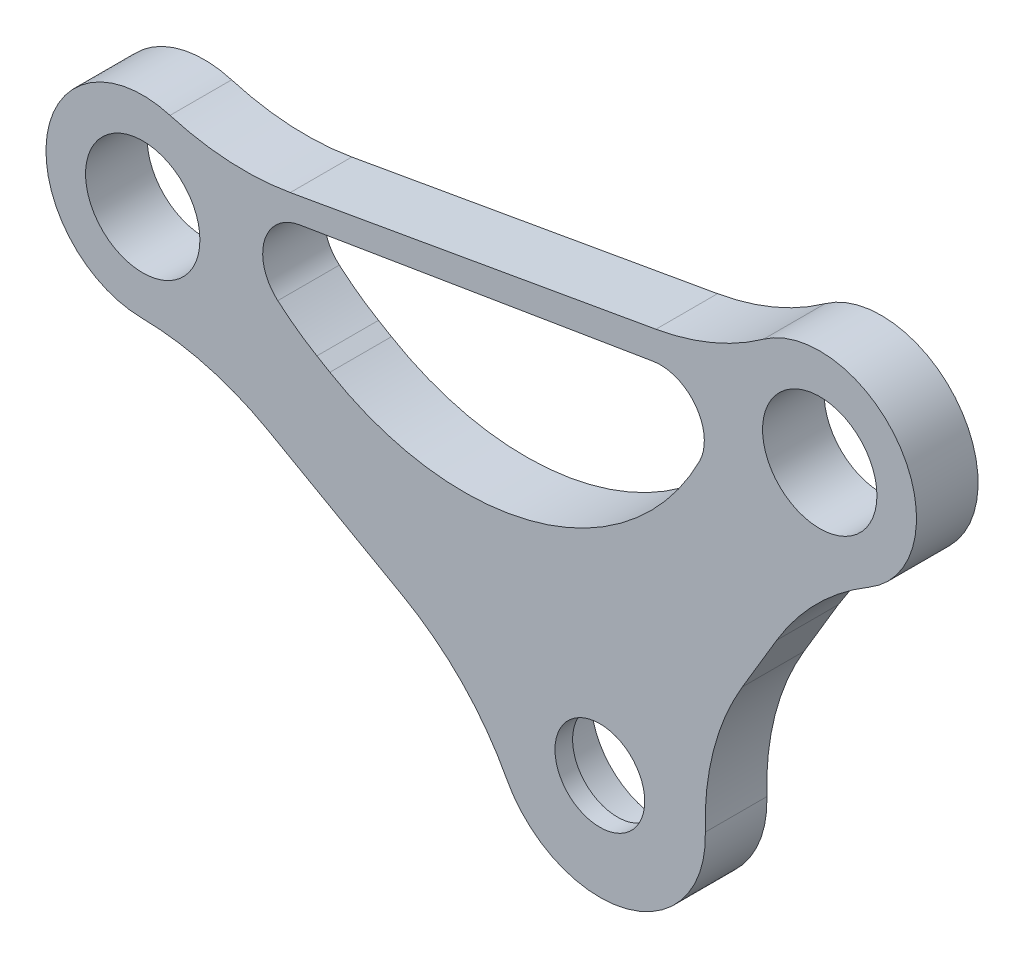
ISO-10303-21;
HEADER;
FILE_DESCRIPTION(('STEP AP214'),'2;1');
FILE_NAME('part.step','',(''),(''),'','','');
FILE_SCHEMA(('AUTOMOTIVE_DESIGN { 1 0 10303 214 1 1 1 1 }'));
ENDSEC;
DATA;
#1=APPLICATION_CONTEXT('core data for automotive mechanical design processes');
#2=APPLICATION_PROTOCOL_DEFINITION('international standard','automotive_design',2000,#1);
#3=PRODUCT_CONTEXT('',#1,'mechanical');
#4=PRODUCT('Part','Part','',(#3));
#5=PRODUCT_RELATED_PRODUCT_CATEGORY('part','',(#4));
#6=PRODUCT_DEFINITION_FORMATION('','',#4);
#7=PRODUCT_DEFINITION_CONTEXT('part definition',#1,'design');
#8=PRODUCT_DEFINITION('design','',#6,#7);
#9=PRODUCT_DEFINITION_SHAPE('','',#8);
#10=(LENGTH_UNIT() NAMED_UNIT(*) SI_UNIT(.MILLI.,.METRE.));
#11=(NAMED_UNIT(*) PLANE_ANGLE_UNIT() SI_UNIT($,.RADIAN.));
#12=(NAMED_UNIT(*) SI_UNIT($,.STERADIAN.) SOLID_ANGLE_UNIT());
#13=UNCERTAINTY_MEASURE_WITH_UNIT(LENGTH_MEASURE(1.E-05),#10,'distance_accuracy_value','');
#14=(GEOMETRIC_REPRESENTATION_CONTEXT(3) GLOBAL_UNCERTAINTY_ASSIGNED_CONTEXT((#13)) GLOBAL_UNIT_ASSIGNED_CONTEXT((#10,
#11,#12)) REPRESENTATION_CONTEXT('',''));
#15=CARTESIAN_POINT('',(0.,0.,0.));
#16=DIRECTION('',(0.,0.,1.));
#17=DIRECTION('',(1.,0.,0.));
#18=AXIS2_PLACEMENT_3D('',#15,#16,#17);
#19=CARTESIAN_POINT('',(-1.73725269888501E-11,9.85245183592049E-11,7.));
#20=DIRECTION('',(0.,0.,-1.));
#21=DIRECTION('',(-1.,0.,0.));
#22=AXIS2_PLACEMENT_3D('',#19,#20,#21);
#23=CYLINDRICAL_SURFACE('',#22,5.10000000000594);
#24=CARTESIAN_POINT('',(-1.73725269888501E-11,9.85245183592049E-11,7.));
#25=DIRECTION('',(0.,0.,1.));
#26=DIRECTION('',(1.,0.,0.));
#27=AXIS2_PLACEMENT_3D('',#24,#25,#26);
#28=CIRCLE('',#27,5.10000000000594);
#29=CARTESIAN_POINT('',(5.09999999998856,9.85245183592049E-11,7.));
#30=VERTEX_POINT('',#29);
#31=EDGE_CURVE('E259',#30,#30,#28,.T.);
#32=ORIENTED_EDGE('',*,*,#31,.T.);
#33=EDGE_LOOP('',(#32));
#34=FACE_BOUND('',#33,.T.);
#35=CARTESIAN_POINT('',(-1.73725269888501E-11,9.85245183592049E-11,5.));
#36=DIRECTION('',(0.,0.,-1.));
#37=DIRECTION('',(-1.,0.,0.));
#38=AXIS2_PLACEMENT_3D('',#35,#36,#37);
#39=CIRCLE('',#38,5.10000000000594);
#40=CARTESIAN_POINT('',(-5.10000000002331,9.85245183592049E-11,5.));
#41=VERTEX_POINT('',#40);
#42=EDGE_CURVE('E39',#41,#41,#39,.T.);
#43=ORIENTED_EDGE('',*,*,#42,.T.);
#44=EDGE_LOOP('',(#43));
#45=FACE_BOUND('',#44,.T.);
#46=ADVANCED_FACE('F36',(#34,#45),#23,.F.);
#47=CARTESIAN_POINT('',(1.17088639889799,76.6655205662727,7.));
#48=DIRECTION('',(0.,0.,-1.));
#49=DIRECTION('',(-1.,0.,0.));
#50=AXIS2_PLACEMENT_3D('',#47,#48,#49);
#51=CYLINDRICAL_SURFACE('',#50,30.0000000000034);
#52=CARTESIAN_POINT('',(1.17088639889799,76.6655205662727,0.));
#53=DIRECTION('',(0.,0.,1.));
#54=DIRECTION('',(1.,0.,0.));
#55=AXIS2_PLACEMENT_3D('',#52,#53,#54);
#56=CIRCLE('',#55,30.0000000000034);
#57=CARTESIAN_POINT('',(6.38033060656032,47.1212877780032,0.));
#58=VERTEX_POINT('',#57);
#59=CARTESIAN_POINT('',(18.6068243838144,52.2526537418459,0.));
#60=VERTEX_POINT('',#59);
#61=EDGE_CURVE('E221',#58,#60,#56,.T.);
#62=ORIENTED_EDGE('',*,*,#61,.F.);
#63=DIRECTION('',(0.,0.,-1.));
#64=VECTOR('',#63,1.);
#65=CARTESIAN_POINT('',(6.38033060656032,47.1212877780032,7.));
#66=LINE('',#65,#64);
#67=CARTESIAN_POINT('',(6.38033060656032,47.1212877780032,7.));
#68=VERTEX_POINT('',#67);
#69=EDGE_CURVE('E11',#68,#58,#66,.T.);
#70=ORIENTED_EDGE('',*,*,#69,.F.);
#71=CARTESIAN_POINT('',(1.17088639889799,76.6655205662727,7.));
#72=DIRECTION('',(0.,0.,1.));
#73=DIRECTION('',(1.,0.,0.));
#74=AXIS2_PLACEMENT_3D('',#71,#72,#73);
#75=CIRCLE('',#74,30.0000000000034);
#76=CARTESIAN_POINT('',(18.6068243838144,52.2526537418459,7.));
#77=VERTEX_POINT('',#76);
#78=EDGE_CURVE('E319',#68,#77,#75,.T.);
#79=ORIENTED_EDGE('',*,*,#78,.T.);
#80=DIRECTION('',(0.,0.,-1.));
#81=VECTOR('',#80,1.);
#82=CARTESIAN_POINT('',(18.6068243838144,52.2526537418459,7.));
#83=LINE('',#82,#81);
#84=EDGE_CURVE('E118',#77,#60,#83,.T.);
#85=ORIENTED_EDGE('',*,*,#84,.T.);
#86=EDGE_LOOP('',(#62,#70,#79,#85));
#87=FACE_BOUND('',#86,.T.);
#88=ADVANCED_FACE('F346',(#87),#51,.F.);
#89=CARTESIAN_POINT('',(-7.86582269183549,44.6093071382072,7.));
#90=DIRECTION('',(-0.173648140255302,0.984807759608887,0.));
#91=DIRECTION('',(-0.984807759608887,-0.173648140255302,0.));
#92=AXIS2_PLACEMENT_3D('',#89,#90,#91);
#93=PLANE('',#92);
#94=DIRECTION('',(0.984807759608887,0.173648140255302,0.));
#95=VECTOR('',#94,1.);
#96=CARTESIAN_POINT('',(-7.86582269183549,44.6093071382072,0.));
#97=LINE('',#96,#95);
#98=CARTESIAN_POINT('',(-35.1891109991033,39.7914752782097,0.));
#99=VERTEX_POINT('',#98);
#100=EDGE_CURVE('E224',#99,#58,#97,.T.);
#101=ORIENTED_EDGE('',*,*,#100,.F.);
#102=DIRECTION('',(0.,0.,-1.));
#103=VECTOR('',#102,1.);
#104=CARTESIAN_POINT('',(-35.1891109991033,39.7914752782097,7.));
#105=LINE('',#104,#103);
#106=CARTESIAN_POINT('',(-35.1891109991033,39.7914752782097,7.));
#107=VERTEX_POINT('',#106);
#108=EDGE_CURVE('E45',#107,#99,#105,.T.);
#109=ORIENTED_EDGE('',*,*,#108,.F.);
#110=DIRECTION('',(0.984807759608887,0.173648140255302,0.));
#111=VECTOR('',#110,1.);
#112=CARTESIAN_POINT('',(-7.86582269183549,44.6093071382072,7.));
#113=LINE('',#112,#111);
#114=EDGE_CURVE('E321',#107,#68,#113,.T.);
#115=ORIENTED_EDGE('',*,*,#114,.T.);
#116=ORIENTED_EDGE('',*,*,#69,.T.);
#117=EDGE_LOOP('',(#101,#109,#115,#116));
#118=FACE_BOUND('',#117,.T.);
#119=ADVANCED_FACE('F351',(#118),#93,.T.);
#120=CARTESIAN_POINT('',(-40.398555206765,69.3357080664754,7.));
#121=DIRECTION('',(0.,0.,-1.));
#122=DIRECTION('',(-1.,0.,0.));
#123=AXIS2_PLACEMENT_3D('',#120,#121,#122);
#124=CYLINDRICAL_SURFACE('',#123,29.9999999999993);
#125=CARTESIAN_POINT('',(-40.398555206765,69.3357080664754,0.));
#126=DIRECTION('',(0.,0.,1.));
#127=DIRECTION('',(1.,0.,0.));
#128=AXIS2_PLACEMENT_3D('',#125,#126,#127);
#129=CIRCLE('',#128,29.9999999999993);
#130=CARTESIAN_POINT('',(-48.8592634121305,40.5534840963993,0.));
#131=VERTEX_POINT('',#130);
#132=EDGE_CURVE('E227',#131,#99,#129,.T.);
#133=ORIENTED_EDGE('',*,*,#132,.F.);
#134=DIRECTION('',(0.,0.,-1.));
#135=VECTOR('',#134,1.);
#136=CARTESIAN_POINT('',(-48.8592634121305,40.5534840963993,7.));
#137=LINE('',#136,#135);
#138=CARTESIAN_POINT('',(-48.8592634121305,40.5534840963993,7.));
#139=VERTEX_POINT('',#138);
#140=EDGE_CURVE('E273',#139,#131,#137,.T.);
#141=ORIENTED_EDGE('',*,*,#140,.F.);
#142=CARTESIAN_POINT('',(-40.398555206765,69.3357080664754,7.));
#143=DIRECTION('',(0.,0.,1.));
#144=DIRECTION('',(1.,0.,0.));
#145=AXIS2_PLACEMENT_3D('',#142,#143,#144);
#146=CIRCLE('',#145,29.9999999999993);
#147=EDGE_CURVE('E324',#139,#107,#146,.T.);
#148=ORIENTED_EDGE('',*,*,#147,.T.);
#149=ORIENTED_EDGE('',*,*,#108,.T.);
#150=EDGE_LOOP('',(#133,#141,#148,#149));
#151=FACE_BOUND('',#150,.T.);
#152=ADVANCED_FACE('F354',(#151),#124,.F.);
#153=CARTESIAN_POINT('',(-51.9615230874299,30.0000019740366,7.));
#154=DIRECTION('',(0.,0.,-1.));
#155=DIRECTION('',(-1.,0.,0.));
#156=AXIS2_PLACEMENT_3D('',#153,#154,#155);
#157=CYLINDRICAL_SURFACE('',#156,11.000000000001);
#158=CARTESIAN_POINT('',(-51.9615230874299,30.0000019740366,0.));
#159=DIRECTION('',(0.,0.,1.));
#160=DIRECTION('',(1.,0.,0.));
#161=AXIS2_PLACEMENT_3D('',#158,#159,#160);
#162=CIRCLE('',#161,11.000000000001);
#163=CARTESIAN_POINT('',(-52.0988260166659,19.0008589207962,0.));
#164=VERTEX_POINT('',#163);
#165=EDGE_CURVE('E230',#131,#164,#162,.T.);
#166=ORIENTED_EDGE('',*,*,#165,.T.);
#167=DIRECTION('',(0.,0.,-1.));
#168=VECTOR('',#167,1.);
#169=CARTESIAN_POINT('',(-52.0988260166659,19.0008589207962,7.));
#170=LINE('',#169,#168);
#171=CARTESIAN_POINT('',(-52.0988260166659,19.0008589207962,7.));
#172=VERTEX_POINT('',#171);
#173=EDGE_CURVE('E271',#172,#164,#170,.T.);
#174=ORIENTED_EDGE('',*,*,#173,.F.);
#175=CARTESIAN_POINT('',(-51.9615230874299,30.0000019740366,7.));
#176=DIRECTION('',(0.,0.,1.));
#177=DIRECTION('',(1.,0.,0.));
#178=AXIS2_PLACEMENT_3D('',#175,#176,#177);
#179=CIRCLE('',#178,11.000000000001);
#180=EDGE_CURVE('E327',#139,#172,#179,.T.);
#181=ORIENTED_EDGE('',*,*,#180,.F.);
#182=ORIENTED_EDGE('',*,*,#140,.T.);
#183=EDGE_LOOP('',(#166,#174,#181,#182));
#184=FACE_BOUND('',#183,.T.);
#185=ADVANCED_FACE('F360',(#184),#157,.T.);
#186=CARTESIAN_POINT('',(-52.4732885509398,-10.9968039516738,7.));
#187=DIRECTION('',(0.,0.,-1.));
#188=DIRECTION('',(-1.,0.,0.));
#189=AXIS2_PLACEMENT_3D('',#186,#187,#188);
#190=CYLINDRICAL_SURFACE('',#189,29.9999999999991);
#191=CARTESIAN_POINT('',(-52.4732885509398,-10.9968039516738,0.));
#192=DIRECTION('',(0.,0.,1.));
#193=DIRECTION('',(1.,0.,0.));
#194=AXIS2_PLACEMENT_3D('',#191,#192,#193);
#195=CIRCLE('',#194,29.9999999999991);
#196=CARTESIAN_POINT('',(-37.7418220743365,15.1371566254883,0.));
#197=VERTEX_POINT('',#196);
#198=EDGE_CURVE('E233',#197,#164,#195,.T.);
#199=ORIENTED_EDGE('',*,*,#198,.F.);
#200=DIRECTION('',(0.,0.,-1.));
#201=VECTOR('',#200,1.);
#202=CARTESIAN_POINT('',(-37.7418220743365,15.1371566254883,7.));
#203=LINE('',#202,#201);
#204=CARTESIAN_POINT('',(-37.7418220743365,15.1371566254883,7.));
#205=VERTEX_POINT('',#204);
#206=EDGE_CURVE('E269',#205,#197,#203,.T.);
#207=ORIENTED_EDGE('',*,*,#206,.F.);
#208=CARTESIAN_POINT('',(-52.4732885509398,-10.9968039516738,7.));
#209=DIRECTION('',(0.,0.,1.));
#210=DIRECTION('',(1.,0.,0.));
#211=AXIS2_PLACEMENT_3D('',#208,#209,#210);
#212=CIRCLE('',#211,29.9999999999991);
#213=EDGE_CURVE('E329',#205,#172,#212,.T.);
#214=ORIENTED_EDGE('',*,*,#213,.T.);
#215=ORIENTED_EDGE('',*,*,#173,.T.);
#216=EDGE_LOOP('',(#199,#207,#214,#215));
#217=FACE_BOUND('',#216,.T.);
#218=ADVANCED_FACE('F364',(#217),#190,.F.);
#219=CARTESIAN_POINT('',(-2.6254506659274,-4.65760990661935,7.));
#220=DIRECTION('',(-0.491048882554393,-0.871132019238234,0.));
#221=DIRECTION('',(0.871132019238234,-0.491048882554393,0.));
#222=AXIS2_PLACEMENT_3D('',#219,#220,#221);
#223=PLANE('',#222);
#224=DIRECTION('',(-0.871132019238234,0.491048882554393,0.));
#225=VECTOR('',#224,1.);
#226=CARTESIAN_POINT('',(-2.6254506659274,-4.65760990661935,0.));
#227=LINE('',#226,#225);
#228=CARTESIAN_POINT('',(-22.3872224038931,6.48191397141323,0.));
#229=VERTEX_POINT('',#228);
#230=EDGE_CURVE('E236',#229,#197,#227,.T.);
#231=ORIENTED_EDGE('',*,*,#230,.F.);
#232=DIRECTION('',(0.,0.,-1.));
#233=VECTOR('',#232,1.);
#234=CARTESIAN_POINT('',(-22.3872224038931,6.48191397141323,7.));
#235=LINE('',#234,#233);
#236=CARTESIAN_POINT('',(-22.3872224038931,6.48191397141323,7.));
#237=VERTEX_POINT('',#236);
#238=EDGE_CURVE('E267',#237,#229,#235,.T.);
#239=ORIENTED_EDGE('',*,*,#238,.F.);
#240=DIRECTION('',(-0.871132019238234,0.491048882554393,0.));
#241=VECTOR('',#240,1.);
#242=CARTESIAN_POINT('',(-2.6254506659274,-4.65760990661935,7.));
#243=LINE('',#242,#241);
#244=EDGE_CURVE('E332',#237,#205,#243,.T.);
#245=ORIENTED_EDGE('',*,*,#244,.T.);
#246=ORIENTED_EDGE('',*,*,#206,.T.);
#247=EDGE_LOOP('',(#231,#239,#245,#246));
#248=FACE_BOUND('',#247,.T.);
#249=ADVANCED_FACE('F367',(#248),#223,.T.);
#250=CARTESIAN_POINT('',(-37.1186888804619,-19.652046605824,7.));
#251=DIRECTION('',(0.,0.,-1.));
#252=DIRECTION('',(-1.,0.,0.));
#253=AXIS2_PLACEMENT_3D('',#250,#251,#252);
#254=CYLINDRICAL_SURFACE('',#253,30.00000000004);
#255=CARTESIAN_POINT('',(-37.1186888804619,-19.652046605824,0.));
#256=DIRECTION('',(0.,0.,1.));
#257=DIRECTION('',(1.,0.,0.));
#258=AXIS2_PLACEMENT_3D('',#255,#256,#257);
#259=CIRCLE('',#258,30.00000000004);
#260=CARTESIAN_POINT('',(-10.605339680115,-5.61487045878997,0.));
#261=VERTEX_POINT('',#260);
#262=EDGE_CURVE('E239',#261,#229,#259,.T.);
#263=ORIENTED_EDGE('',*,*,#262,.F.);
#264=DIRECTION('',(0.,0.,-1.));
#265=VECTOR('',#264,1.);
#266=CARTESIAN_POINT('',(-10.605339680115,-5.61487045878997,7.));
#267=LINE('',#266,#265);
#268=CARTESIAN_POINT('',(-10.605339680115,-5.61487045878997,7.));
#269=VERTEX_POINT('',#268);
#270=EDGE_CURVE('E265',#269,#261,#267,.T.);
#271=ORIENTED_EDGE('',*,*,#270,.F.);
#272=CARTESIAN_POINT('',(-37.1186888804619,-19.652046605824,7.));
#273=DIRECTION('',(0.,0.,1.));
#274=DIRECTION('',(1.,0.,0.));
#275=AXIS2_PLACEMENT_3D('',#272,#273,#274);
#276=CIRCLE('',#275,30.00000000004);
#277=EDGE_CURVE('E335',#269,#237,#276,.T.);
#278=ORIENTED_EDGE('',*,*,#277,.T.);
#279=ORIENTED_EDGE('',*,*,#238,.T.);
#280=EDGE_LOOP('',(#263,#271,#278,#279));
#281=FACE_BOUND('',#280,.T.);
#282=ADVANCED_FACE('F371',(#281),#254,.F.);
#283=CARTESIAN_POINT('',(-1.73725269888501E-11,9.85245183592049E-11,7.));
#284=DIRECTION('',(0.,0.,-1.));
#285=DIRECTION('',(-1.,0.,0.));
#286=AXIS2_PLACEMENT_3D('',#283,#284,#285);
#287=CYLINDRICAL_SURFACE('',#286,12.0000000000128);
#288=CARTESIAN_POINT('',(-1.73725269888501E-11,9.85245183592049E-11,0.));
#289=DIRECTION('',(0.,0.,1.));
#290=DIRECTION('',(1.,0.,0.));
#291=AXIS2_PLACEMENT_3D('',#288,#289,#290);
#292=CIRCLE('',#291,12.0000000000128);
#293=CARTESIAN_POINT('',(11.9927206552319,0.417913011937691,0.));
#294=VERTEX_POINT('',#293);
#295=EDGE_CURVE('E242',#261,#294,#292,.T.);
#296=ORIENTED_EDGE('',*,*,#295,.T.);
#297=DIRECTION('',(0.,0.,-1.));
#298=VECTOR('',#297,1.);
#299=CARTESIAN_POINT('',(11.9927206552319,0.417913011937691,7.));
#300=LINE('',#299,#298);
#301=CARTESIAN_POINT('',(11.9927206552319,0.417913011937691,7.));
#302=VERTEX_POINT('',#301);
#303=EDGE_CURVE('E263',#302,#294,#300,.T.);
#304=ORIENTED_EDGE('',*,*,#303,.F.);
#305=CARTESIAN_POINT('',(-1.73725269888501E-11,9.85245183592049E-11,7.));
#306=DIRECTION('',(0.,0.,1.));
#307=DIRECTION('',(1.,0.,0.));
#308=AXIS2_PLACEMENT_3D('',#305,#306,#307);
#309=CIRCLE('',#308,12.0000000000128);
#310=EDGE_CURVE('E338',#269,#302,#309,.T.);
#311=ORIENTED_EDGE('',*,*,#310,.F.);
#312=ORIENTED_EDGE('',*,*,#270,.T.);
#313=EDGE_LOOP('',(#296,#304,#311,#312));
#314=FACE_BOUND('',#313,.T.);
#315=ADVANCED_FACE('F374',(#314),#287,.T.);
#316=CARTESIAN_POINT('',(41.9745222933189,1.46269554163059,7.));
#317=DIRECTION('',(0.,0.,-1.));
#318=DIRECTION('',(-1.,0.,0.));
#319=AXIS2_PLACEMENT_3D('',#316,#317,#318);
#320=CYLINDRICAL_SURFACE('',#319,30.0000000000087);
#321=CARTESIAN_POINT('',(41.9745222933189,1.46269554163059,0.));
#322=DIRECTION('',(0.,0.,1.));
#323=DIRECTION('',(1.,0.,0.));
#324=AXIS2_PLACEMENT_3D('',#321,#322,#323);
#325=CIRCLE('',#324,30.0000000000087);
#326=CARTESIAN_POINT('',(16.2033873800888,16.8200587685851,0.));
#327=VERTEX_POINT('',#326);
#328=EDGE_CURVE('E245',#327,#294,#325,.T.);
#329=ORIENTED_EDGE('',*,*,#328,.F.);
#330=DIRECTION('',(0.,0.,-1.));
#331=VECTOR('',#330,1.);
#332=CARTESIAN_POINT('',(16.2033873800888,16.8200587685851,7.));
#333=LINE('',#332,#331);
#334=CARTESIAN_POINT('',(16.2033873800888,16.8200587685851,7.));
#335=VERTEX_POINT('',#334);
#336=EDGE_CURVE('E182',#335,#327,#333,.T.);
#337=ORIENTED_EDGE('',*,*,#336,.F.);
#338=CARTESIAN_POINT('',(41.9745222933189,1.46269554163059,7.));
#339=DIRECTION('',(0.,0.,1.));
#340=DIRECTION('',(1.,0.,0.));
#341=AXIS2_PLACEMENT_3D('',#338,#339,#340);
#342=CIRCLE('',#341,30.0000000000087);
#343=EDGE_CURVE('E189',#335,#302,#342,.T.);
#344=ORIENTED_EDGE('',*,*,#343,.T.);
#345=ORIENTED_EDGE('',*,*,#303,.T.);
#346=EDGE_LOOP('',(#329,#337,#344,#345));
#347=FACE_BOUND('',#346,.T.);
#348=ADVANCED_FACE('F341',(#347),#320,.F.);
#349=CARTESIAN_POINT('',(4.56057257435214,-2.71770606079994,7.));
#350=DIRECTION('',(0.859037830440222,-0.511912107565895,0.));
#351=DIRECTION('',(0.511912107565895,0.859037830440222,0.));
#352=AXIS2_PLACEMENT_3D('',#349,#350,#351);
#353=PLANE('',#352);
#354=DIRECTION('',(-0.511912107565895,-0.859037830440222,0.));
#355=VECTOR('',#354,1.);
#356=CARTESIAN_POINT('',(4.56057257435214,-2.71770606079994,0.));
#357=LINE('',#356,#355);
#358=CARTESIAN_POINT('',(20.1087588727908,23.373648348847,0.));
#359=VERTEX_POINT('',#358);
#360=EDGE_CURVE('E177',#359,#327,#357,.T.);
#361=ORIENTED_EDGE('',*,*,#360,.F.);
#362=DIRECTION('',(0.,0.,-1.));
#363=VECTOR('',#362,1.);
#364=CARTESIAN_POINT('',(20.1087588727908,23.373648348847,7.));
#365=LINE('',#364,#363);
#366=CARTESIAN_POINT('',(20.1087588727908,23.373648348847,7.));
#367=VERTEX_POINT('',#366);
#368=EDGE_CURVE('E172',#367,#359,#365,.T.);
#369=ORIENTED_EDGE('',*,*,#368,.F.);
#370=DIRECTION('',(-0.511912107565895,-0.859037830440222,0.));
#371=VECTOR('',#370,1.);
#372=CARTESIAN_POINT('',(4.56057257435214,-2.71770606079994,7.));
#373=LINE('',#372,#371);
#374=EDGE_CURVE('E175',#367,#335,#373,.T.);
#375=ORIENTED_EDGE('',*,*,#374,.T.);
#376=ORIENTED_EDGE('',*,*,#336,.T.);
#377=EDGE_LOOP('',(#361,#369,#375,#376));
#378=FACE_BOUND('',#377,.T.);
#379=ADVANCED_FACE('F174',(#378),#353,.T.);
#380=CARTESIAN_POINT('',(45.879893786029,8.0162851219754,7.));
#381=DIRECTION('',(0.,0.,-1.));
#382=DIRECTION('',(-1.,0.,0.));
#383=AXIS2_PLACEMENT_3D('',#380,#381,#382);
#384=CYLINDRICAL_SURFACE('',#383,29.9999999999681);
#385=CARTESIAN_POINT('',(45.879893786029,8.0162851219754,0.));
#386=DIRECTION('',(0.,0.,1.));
#387=DIRECTION('',(1.,0.,0.));
#388=AXIS2_PLACEMENT_3D('',#385,#386,#387);
#389=CIRCLE('',#388,29.9999999999681);
#390=CARTESIAN_POINT('',(30.6019239267762,33.8345661836157,0.));
#391=VERTEX_POINT('',#390);
#392=EDGE_CURVE('E249',#391,#359,#389,.T.);
#393=ORIENTED_EDGE('',*,*,#392,.F.);
#394=DIRECTION('',(0.,0.,-1.));
#395=VECTOR('',#394,1.);
#396=CARTESIAN_POINT('',(30.6019239267762,33.8345661836157,7.));
#397=LINE('',#396,#395);
#398=CARTESIAN_POINT('',(30.6019239267762,33.8345661836157,7.));
#399=VERTEX_POINT('',#398);
#400=EDGE_CURVE('E111',#399,#391,#397,.T.);
#401=ORIENTED_EDGE('',*,*,#400,.F.);
#402=CARTESIAN_POINT('',(45.879893786029,8.0162851219754,7.));
#403=DIRECTION('',(0.,0.,1.));
#404=DIRECTION('',(1.,0.,0.));
#405=AXIS2_PLACEMENT_3D('',#402,#403,#404);
#406=CIRCLE('',#405,29.9999999999681);
#407=EDGE_CURVE('E187',#399,#367,#406,.T.);
#408=ORIENTED_EDGE('',*,*,#407,.T.);
#409=ORIENTED_EDGE('',*,*,#368,.T.);
#410=EDGE_LOOP('',(#393,#401,#408,#409));
#411=FACE_BOUND('',#410,.T.);
#412=ADVANCED_FACE('F191',(#411),#384,.F.);
#413=CARTESIAN_POINT('',(-16.8955427875465,51.0494424745435,7.));
#414=DIRECTION('',(0.,0.,-1.));
#415=DIRECTION('',(-1.,0.,0.));
#416=AXIS2_PLACEMENT_3D('',#413,#414,#415);
#417=CYLINDRICAL_SURFACE('',#416,29.9999999994717);
#418=CARTESIAN_POINT('',(-16.8955427875465,51.0494424745435,0.));
#419=DIRECTION('',(0.,0.,1.));
#420=DIRECTION('',(1.,0.,0.));
#421=AXIS2_PLACEMENT_3D('',#418,#419,#420);
#422=CIRCLE('',#421,29.9999999994717);
#423=CARTESIAN_POINT('',(-36.6118874812716,28.4382560420352,0.));
#424=VERTEX_POINT('',#423);
#425=CARTESIAN_POINT('',(-32.1624852722381,25.2246391425252,0.));
#426=VERTEX_POINT('',#425);
#427=EDGE_CURVE('E203',#424,#426,#422,.T.);
#428=ORIENTED_EDGE('',*,*,#427,.F.);
#429=DIRECTION('',(0.,0.,-1.));
#430=VECTOR('',#429,1.);
#431=CARTESIAN_POINT('',(-36.6118874812716,28.4382560420352,7.));
#432=LINE('',#431,#430);
#433=CARTESIAN_POINT('',(-36.6118874812716,28.4382560420352,7.));
#434=VERTEX_POINT('',#433);
#435=EDGE_CURVE('E125',#434,#424,#432,.T.);
#436=ORIENTED_EDGE('',*,*,#435,.F.);
#437=CARTESIAN_POINT('',(-16.8955427875465,51.0494424745435,7.));
#438=DIRECTION('',(0.,0.,1.));
#439=DIRECTION('',(1.,0.,0.));
#440=AXIS2_PLACEMENT_3D('',#437,#438,#439);
#441=CIRCLE('',#440,29.9999999994717);
#442=CARTESIAN_POINT('',(-32.1624852722381,25.2246391425252,7.));
#443=VERTEX_POINT('',#442);
#444=EDGE_CURVE('E306',#434,#443,#441,.T.);
#445=ORIENTED_EDGE('',*,*,#444,.T.);
#446=DIRECTION('',(0.,0.,-1.));
#447=VECTOR('',#446,1.);
#448=CARTESIAN_POINT('',(-32.1624852722381,25.2246391425252,7.));
#449=LINE('',#448,#447);
#450=EDGE_CURVE('E202',#443,#426,#449,.T.);
#451=ORIENTED_EDGE('',*,*,#450,.T.);
#452=EDGE_LOOP('',(#428,#436,#445,#451));
#453=FACE_BOUND('',#452,.T.);
#454=ADVANCED_FACE('F290',(#453),#417,.F.);
#455=CARTESIAN_POINT('',(-33.3258300322649,32.2067871141943,7.));
#456=DIRECTION('',(0.,0.,-1.));
#457=DIRECTION('',(-1.,0.,0.));
#458=AXIS2_PLACEMENT_3D('',#455,#456,#457);
#459=CYLINDRICAL_SURFACE('',#458,5.0000000000001);
#460=CARTESIAN_POINT('',(-33.3258300322649,32.2067871141943,0.));
#461=DIRECTION('',(0.,0.,1.));
#462=DIRECTION('',(1.,0.,0.));
#463=AXIS2_PLACEMENT_3D('',#460,#461,#462);
#464=CIRCLE('',#463,5.0000000000001);
#465=CARTESIAN_POINT('',(-34.1435085359799,37.1394741977642,0.));
#466=VERTEX_POINT('',#465);
#467=EDGE_CURVE('E206',#466,#424,#464,.T.);
#468=ORIENTED_EDGE('',*,*,#467,.F.);
#469=DIRECTION('',(0.,0.,-1.));
#470=VECTOR('',#469,1.);
#471=CARTESIAN_POINT('',(-34.1435085359799,37.1394741977642,7.));
#472=LINE('',#471,#470);
#473=CARTESIAN_POINT('',(-34.1435085359799,37.1394741977642,7.));
#474=VERTEX_POINT('',#473);
#475=EDGE_CURVE('E283',#474,#466,#472,.T.);
#476=ORIENTED_EDGE('',*,*,#475,.F.);
#477=CARTESIAN_POINT('',(-33.3258300322649,32.2067871141943,7.));
#478=DIRECTION('',(0.,0.,1.));
#479=DIRECTION('',(1.,0.,0.));
#480=AXIS2_PLACEMENT_3D('',#477,#478,#479);
#481=CIRCLE('',#480,5.0000000000001);
#482=EDGE_CURVE('E289',#474,#434,#481,.T.);
#483=ORIENTED_EDGE('',*,*,#482,.T.);
#484=ORIENTED_EDGE('',*,*,#435,.T.);
#485=EDGE_LOOP('',(#468,#476,#483,#484));
#486=FACE_BOUND('',#485,.T.);
#487=ADVANCED_FACE('F287',(#486),#459,.F.);
#488=CARTESIAN_POINT('',(-6.90499463476363,41.6547306719466,7.));
#489=DIRECTION('',(0.163535700736602,-0.986537416717982,0.));
#490=DIRECTION('',(0.986537416717982,0.163535700736602,0.));
#491=AXIS2_PLACEMENT_3D('',#488,#489,#490);
#492=PLANE('',#491);
#493=DIRECTION('',(-0.986537416717982,-0.163535700736602,0.));
#494=VECTOR('',#493,1.);
#495=CARTESIAN_POINT('',(-6.90499463476363,41.6547306719466,0.));
#496=LINE('',#495,#494);
#497=CARTESIAN_POINT('',(6.06060925962171,43.8040045691248,0.));
#498=VERTEX_POINT('',#497);
#499=EDGE_CURVE('E209',#498,#466,#496,.T.);
#500=ORIENTED_EDGE('',*,*,#499,.F.);
#501=DIRECTION('',(0.,0.,-1.));
#502=VECTOR('',#501,1.);
#503=CARTESIAN_POINT('',(6.06060925962171,43.8040045691248,7.));
#504=LINE('',#503,#502);
#505=CARTESIAN_POINT('',(6.06060925962171,43.8040045691248,7.));
#506=VERTEX_POINT('',#505);
#507=EDGE_CURVE('E281',#506,#498,#504,.T.);
#508=ORIENTED_EDGE('',*,*,#507,.F.);
#509=DIRECTION('',(-0.986537416717982,-0.163535700736602,0.));
#510=VECTOR('',#509,1.);
#511=CARTESIAN_POINT('',(-6.90499463476363,41.6547306719466,7.));
#512=LINE('',#511,#510);
#513=EDGE_CURVE('E302',#506,#474,#512,.T.);
#514=ORIENTED_EDGE('',*,*,#513,.T.);
#515=ORIENTED_EDGE('',*,*,#475,.T.);
#516=EDGE_LOOP('',(#500,#508,#514,#515));
#517=FACE_BOUND('',#516,.T.);
#518=ADVANCED_FACE('F299',(#517),#492,.T.);
#519=CARTESIAN_POINT('',(6.87828776324647,38.8713174854886,7.));
#520=DIRECTION('',(0.,0.,-1.));
#521=DIRECTION('',(-1.,0.,0.));
#522=AXIS2_PLACEMENT_3D('',#519,#520,#521);
#523=CYLINDRICAL_SURFACE('',#522,5.0000000000361);
#524=CARTESIAN_POINT('',(6.87828776324647,38.8713174854886,0.));
#525=DIRECTION('',(0.,0.,1.));
#526=DIRECTION('',(1.,0.,0.));
#527=AXIS2_PLACEMENT_3D('',#524,#525,#526);
#528=CIRCLE('',#527,5.0000000000361);
#529=CARTESIAN_POINT('',(11.3378236135318,36.6102248292013,0.));
#530=VERTEX_POINT('',#529);
#531=EDGE_CURVE('E212',#530,#498,#528,.T.);
#532=ORIENTED_EDGE('',*,*,#531,.F.);
#533=DIRECTION('',(0.,0.,-1.));
#534=VECTOR('',#533,1.);
#535=CARTESIAN_POINT('',(11.3378236135318,36.6102248292013,7.));
#536=LINE('',#535,#534);
#537=CARTESIAN_POINT('',(11.3378236135318,36.6102248292013,7.));
#538=VERTEX_POINT('',#537);
#539=EDGE_CURVE('E279',#538,#530,#536,.T.);
#540=ORIENTED_EDGE('',*,*,#539,.F.);
#541=CARTESIAN_POINT('',(6.87828776324647,38.8713174854886,7.));
#542=DIRECTION('',(0.,0.,1.));
#543=DIRECTION('',(1.,0.,0.));
#544=AXIS2_PLACEMENT_3D('',#541,#542,#543);
#545=CIRCLE('',#544,5.0000000000361);
#546=EDGE_CURVE('E308',#538,#506,#545,.T.);
#547=ORIENTED_EDGE('',*,*,#546,.T.);
#548=ORIENTED_EDGE('',*,*,#507,.T.);
#549=EDGE_LOOP('',(#532,#540,#547,#548));
#550=FACE_BOUND('',#549,.T.);
#551=ADVANCED_FACE('F459',(#550),#523,.F.);
#552=CARTESIAN_POINT('',(-15.4193914879641,50.1767807670107,7.));
#553=DIRECTION('',(0.,0.,-1.));
#554=DIRECTION('',(-1.,0.,0.));
#555=AXIS2_PLACEMENT_3D('',#552,#553,#554);
#556=CYLINDRICAL_SURFACE('',#555,30.0000000000239);
#557=CARTESIAN_POINT('',(-15.4193914879641,50.1767807670107,0.));
#558=DIRECTION('',(0.,0.,1.));
#559=DIRECTION('',(1.,0.,0.));
#560=AXIS2_PLACEMENT_3D('',#557,#558,#559);
#561=CIRCLE('',#560,30.0000000000239);
#562=CARTESIAN_POINT('',(-30.6863339730921,24.3519774346164,0.));
#563=VERTEX_POINT('',#562);
#564=EDGE_CURVE('E215',#563,#530,#561,.T.);
#565=ORIENTED_EDGE('',*,*,#564,.F.);
#566=DIRECTION('',(0.,0.,-1.));
#567=VECTOR('',#566,1.);
#568=CARTESIAN_POINT('',(-30.6863339730921,24.3519774346164,7.));
#569=LINE('',#568,#567);
#570=CARTESIAN_POINT('',(-30.6863339730921,24.3519774346164,7.));
#571=VERTEX_POINT('',#570);
#572=EDGE_CURVE('E277',#571,#563,#569,.T.);
#573=ORIENTED_EDGE('',*,*,#572,.F.);
#574=CARTESIAN_POINT('',(-15.4193914879641,50.1767807670107,7.));
#575=DIRECTION('',(0.,0.,1.));
#576=DIRECTION('',(1.,0.,0.));
#577=AXIS2_PLACEMENT_3D('',#574,#575,#576);
#578=CIRCLE('',#577,30.0000000000239);
#579=EDGE_CURVE('E314',#571,#538,#578,.T.);
#580=ORIENTED_EDGE('',*,*,#579,.T.);
#581=ORIENTED_EDGE('',*,*,#539,.T.);
#582=EDGE_LOOP('',(#565,#573,#580,#581));
#583=FACE_BOUND('',#582,.T.);
#584=ADVANCED_FACE('F427',(#583),#556,.F.);
#585=CARTESIAN_POINT('',(25.0000016450209,43.3012692395681,7.));
#586=DIRECTION('',(0.,0.,-1.));
#587=DIRECTION('',(-1.,0.,0.));
#588=AXIS2_PLACEMENT_3D('',#585,#586,#587);
#589=CYLINDRICAL_SURFACE('',#588,6.50000000000594);
#590=CARTESIAN_POINT('',(25.0000016450209,43.3012692395681,7.));
#591=DIRECTION('',(0.,0.,1.));
#592=DIRECTION('',(1.,0.,0.));
#593=AXIS2_PLACEMENT_3D('',#590,#591,#592);
#594=CIRCLE('',#593,6.50000000000594);
#595=CARTESIAN_POINT('',(31.5000016450269,43.3012692395681,7.));
#596=VERTEX_POINT('',#595);
#597=EDGE_CURVE('E193',#596,#596,#594,.T.);
#598=ORIENTED_EDGE('',*,*,#597,.T.);
#599=EDGE_LOOP('',(#598));
#600=FACE_BOUND('',#599,.T.);
#601=CARTESIAN_POINT('',(25.0000016450209,43.3012692395681,0.));
#602=DIRECTION('',(0.,0.,1.));
#603=DIRECTION('',(1.,0.,0.));
#604=AXIS2_PLACEMENT_3D('',#601,#602,#603);
#605=CIRCLE('',#604,6.50000000000594);
#606=CARTESIAN_POINT('',(31.5000016450269,43.3012692395681,0.));
#607=VERTEX_POINT('',#606);
#608=EDGE_CURVE('E253',#607,#607,#605,.T.);
#609=ORIENTED_EDGE('',*,*,#608,.F.);
#610=EDGE_LOOP('',(#609));
#611=FACE_BOUND('',#610,.T.);
#612=ADVANCED_FACE('F424',(#600,#611),#589,.F.);
#613=CARTESIAN_POINT('',(25.0000016450209,43.3012692395681,7.));
#614=DIRECTION('',(0.,0.,-1.));
#615=DIRECTION('',(-1.,0.,0.));
#616=AXIS2_PLACEMENT_3D('',#613,#614,#615);
#617=CYLINDRICAL_SURFACE('',#616,11.0000000000376);
#618=CARTESIAN_POINT('',(25.0000016450209,43.3012692395681,0.));
#619=DIRECTION('',(0.,0.,1.));
#620=DIRECTION('',(1.,0.,0.));
#621=AXIS2_PLACEMENT_3D('',#618,#619,#620);
#622=CIRCLE('',#621,11.0000000000376);
#623=EDGE_CURVE('E251',#391,#60,#622,.T.);
#624=ORIENTED_EDGE('',*,*,#623,.T.);
#625=ORIENTED_EDGE('',*,*,#84,.F.);
#626=CARTESIAN_POINT('',(25.0000016450209,43.3012692395681,7.));
#627=DIRECTION('',(0.,0.,1.));
#628=DIRECTION('',(1.,0.,0.));
#629=AXIS2_PLACEMENT_3D('',#626,#627,#628);
#630=CIRCLE('',#629,11.0000000000376);
#631=EDGE_CURVE('E54',#399,#77,#630,.T.);
#632=ORIENTED_EDGE('',*,*,#631,.F.);
#633=ORIENTED_EDGE('',*,*,#400,.T.);
#634=EDGE_LOOP('',(#624,#625,#632,#633));
#635=FACE_BOUND('',#634,.T.);
#636=ADVANCED_FACE('F345',(#635),#617,.T.);
#637=CARTESIAN_POINT('',(2.72088351710319,4.6025117204023,7.));
#638=DIRECTION('',(-0.508898082821383,-0.860826777755386,0.));
#639=DIRECTION('',(0.860826777755386,-0.508898082821383,0.));
#640=AXIS2_PLACEMENT_3D('',#637,#638,#639);
#641=PLANE('',#640);
#642=DIRECTION('',(-0.860826777755386,0.508898082821383,0.));
#643=VECTOR('',#642,1.);
#644=CARTESIAN_POINT('',(2.72088351710319,4.6025117204023,0.));
#645=LINE('',#644,#643);
#646=EDGE_CURVE('E218',#563,#426,#645,.T.);
#647=ORIENTED_EDGE('',*,*,#646,.T.);
#648=ORIENTED_EDGE('',*,*,#450,.F.);
#649=DIRECTION('',(-0.860826777755386,0.508898082821383,0.));
#650=VECTOR('',#649,1.);
#651=CARTESIAN_POINT('',(2.72088351710319,4.6025117204023,7.));
#652=LINE('',#651,#650);
#653=EDGE_CURVE('E317',#571,#443,#652,.T.);
#654=ORIENTED_EDGE('',*,*,#653,.F.);
#655=ORIENTED_EDGE('',*,*,#572,.T.);
#656=EDGE_LOOP('',(#647,#648,#654,#655));
#657=FACE_BOUND('',#656,.T.);
#658=ADVANCED_FACE('F422',(#657),#641,.F.);
#659=CARTESIAN_POINT('',(-51.9615230874299,30.0000019740366,7.));
#660=DIRECTION('',(0.,0.,-1.));
#661=DIRECTION('',(-1.,0.,0.));
#662=AXIS2_PLACEMENT_3D('',#659,#660,#661);
#663=CYLINDRICAL_SURFACE('',#662,6.49999999999622);
#664=CARTESIAN_POINT('',(-51.9615230874299,30.0000019740366,7.));
#665=DIRECTION('',(0.,0.,1.));
#666=DIRECTION('',(1.,0.,0.));
#667=AXIS2_PLACEMENT_3D('',#664,#665,#666);
#668=CIRCLE('',#667,6.49999999999622);
#669=CARTESIAN_POINT('',(-45.4615230874337,30.0000019740366,7.));
#670=VERTEX_POINT('',#669);
#671=EDGE_CURVE('E199',#670,#670,#668,.T.);
#672=ORIENTED_EDGE('',*,*,#671,.T.);
#673=EDGE_LOOP('',(#672));
#674=FACE_BOUND('',#673,.T.);
#675=CARTESIAN_POINT('',(-51.9615230874299,30.0000019740366,0.));
#676=DIRECTION('',(0.,0.,1.));
#677=DIRECTION('',(1.,0.,0.));
#678=AXIS2_PLACEMENT_3D('',#675,#676,#677);
#679=CIRCLE('',#678,6.49999999999622);
#680=CARTESIAN_POINT('',(-45.4615230874337,30.0000019740366,0.));
#681=VERTEX_POINT('',#680);
#682=EDGE_CURVE('E256',#681,#681,#679,.T.);
#683=ORIENTED_EDGE('',*,*,#682,.F.);
#684=EDGE_LOOP('',(#683));
#685=FACE_BOUND('',#684,.T.);
#686=ADVANCED_FACE('F416',(#674,#685),#663,.F.);
#687=CARTESIAN_POINT('',(0.,0.,7.));
#688=DIRECTION('',(0.,0.,1.));
#689=DIRECTION('',(1.,0.,0.));
#690=AXIS2_PLACEMENT_3D('',#687,#688,#689);
#691=PLANE('',#690);
#692=ORIENTED_EDGE('',*,*,#31,.F.);
#693=EDGE_LOOP('',(#692));
#694=FACE_BOUND('',#693,.T.);
#695=ORIENTED_EDGE('',*,*,#444,.F.);
#696=ORIENTED_EDGE('',*,*,#482,.F.);
#697=ORIENTED_EDGE('',*,*,#513,.F.);
#698=ORIENTED_EDGE('',*,*,#546,.F.);
#699=ORIENTED_EDGE('',*,*,#579,.F.);
#700=ORIENTED_EDGE('',*,*,#653,.T.);
#701=EDGE_LOOP('',(#695,#696,#697,#698,#699,#700));
#702=FACE_BOUND('',#701,.T.);
#703=ORIENTED_EDGE('',*,*,#78,.F.);
#704=ORIENTED_EDGE('',*,*,#114,.F.);
#705=ORIENTED_EDGE('',*,*,#147,.F.);
#706=ORIENTED_EDGE('',*,*,#180,.T.);
#707=ORIENTED_EDGE('',*,*,#213,.F.);
#708=ORIENTED_EDGE('',*,*,#244,.F.);
#709=ORIENTED_EDGE('',*,*,#277,.F.);
#710=ORIENTED_EDGE('',*,*,#310,.T.);
#711=ORIENTED_EDGE('',*,*,#343,.F.);
#712=ORIENTED_EDGE('',*,*,#374,.F.);
#713=ORIENTED_EDGE('',*,*,#407,.F.);
#714=ORIENTED_EDGE('',*,*,#631,.T.);
#715=EDGE_LOOP('',(#703,#704,#705,#706,#707,#708,#709,#710,#711,#712,#713,#714));
#716=FACE_BOUND('',#715,.T.);
#717=ORIENTED_EDGE('',*,*,#597,.F.);
#718=EDGE_LOOP('',(#717));
#719=FACE_BOUND('',#718,.T.);
#720=ORIENTED_EDGE('',*,*,#671,.F.);
#721=EDGE_LOOP('',(#720));
#722=FACE_BOUND('',#721,.T.);
#723=ADVANCED_FACE('F185',(#694,#702,#716,#719,#722),#691,.T.);
#724=CARTESIAN_POINT('',(0.,0.,0.));
#725=DIRECTION('',(0.,0.,1.));
#726=DIRECTION('',(1.,0.,0.));
#727=AXIS2_PLACEMENT_3D('',#724,#725,#726);
#728=PLANE('',#727);
#729=CARTESIAN_POINT('',(-1.73725269888501E-11,9.85245183592049E-11,0.));
#730=DIRECTION('',(0.,0.,-1.));
#731=DIRECTION('',(-1.,0.,0.));
#732=AXIS2_PLACEMENT_3D('',#729,#730,#731);
#733=CIRCLE('',#732,7.99999999999625);
#734=CARTESIAN_POINT('',(-8.00000000001362,9.85245183592049E-11,0.));
#735=VERTEX_POINT('',#734);
#736=EDGE_CURVE('E397',#735,#735,#733,.T.);
#737=ORIENTED_EDGE('',*,*,#736,.F.);
#738=EDGE_LOOP('',(#737));
#739=FACE_BOUND('',#738,.T.);
#740=ORIENTED_EDGE('',*,*,#427,.T.);
#741=ORIENTED_EDGE('',*,*,#646,.F.);
#742=ORIENTED_EDGE('',*,*,#564,.T.);
#743=ORIENTED_EDGE('',*,*,#531,.T.);
#744=ORIENTED_EDGE('',*,*,#499,.T.);
#745=ORIENTED_EDGE('',*,*,#467,.T.);
#746=EDGE_LOOP('',(#740,#741,#742,#743,#744,#745));
#747=FACE_BOUND('',#746,.T.);
#748=ORIENTED_EDGE('',*,*,#61,.T.);
#749=ORIENTED_EDGE('',*,*,#623,.F.);
#750=ORIENTED_EDGE('',*,*,#392,.T.);
#751=ORIENTED_EDGE('',*,*,#360,.T.);
#752=ORIENTED_EDGE('',*,*,#328,.T.);
#753=ORIENTED_EDGE('',*,*,#295,.F.);
#754=ORIENTED_EDGE('',*,*,#262,.T.);
#755=ORIENTED_EDGE('',*,*,#230,.T.);
#756=ORIENTED_EDGE('',*,*,#198,.T.);
#757=ORIENTED_EDGE('',*,*,#165,.F.);
#758=ORIENTED_EDGE('',*,*,#132,.T.);
#759=ORIENTED_EDGE('',*,*,#100,.T.);
#760=EDGE_LOOP('',(#748,#749,#750,#751,#752,#753,#754,#755,#756,#757,#758,#759));
#761=FACE_BOUND('',#760,.T.);
#762=ORIENTED_EDGE('',*,*,#608,.T.);
#763=EDGE_LOOP('',(#762));
#764=FACE_BOUND('',#763,.T.);
#765=ORIENTED_EDGE('',*,*,#682,.T.);
#766=EDGE_LOOP('',(#765));
#767=FACE_BOUND('',#766,.T.);
#768=ADVANCED_FACE('F294',(#739,#747,#761,#764,#767),#728,.F.);
#769=CARTESIAN_POINT('',(-1.73725269888501E-11,9.85245183592049E-11,5.));
#770=DIRECTION('',(0.,0.,-1.));
#771=DIRECTION('',(-1.,0.,0.));
#772=AXIS2_PLACEMENT_3D('',#769,#770,#771);
#773=CYLINDRICAL_SURFACE('',#772,7.99999999999625);
#774=CARTESIAN_POINT('',(-1.73725269888501E-11,9.85245183592049E-11,5.));
#775=DIRECTION('',(0.,0.,-1.));
#776=DIRECTION('',(-1.,0.,0.));
#777=AXIS2_PLACEMENT_3D('',#774,#775,#776);
#778=CIRCLE('',#777,7.99999999999625);
#779=CARTESIAN_POINT('',(-8.00000000001362,9.85245183592049E-11,5.));
#780=VERTEX_POINT('',#779);
#781=EDGE_CURVE('E395',#780,#780,#778,.T.);
#782=ORIENTED_EDGE('',*,*,#781,.F.);
#783=EDGE_LOOP('',(#782));
#784=FACE_BOUND('',#783,.T.);
#785=ORIENTED_EDGE('',*,*,#736,.T.);
#786=EDGE_LOOP('',(#785));
#787=FACE_BOUND('',#786,.T.);
#788=ADVANCED_FACE('F405',(#784,#787),#773,.F.);
#789=CARTESIAN_POINT('',(-1.73725269888501E-11,9.85245183592049E-11,5.));
#790=DIRECTION('',(0.,0.,-1.));
#791=DIRECTION('',(-1.,0.,0.));
#792=AXIS2_PLACEMENT_3D('',#789,#790,#791);
#793=PLANE('',#792);
#794=ORIENTED_EDGE('',*,*,#42,.F.);
#795=EDGE_LOOP('',(#794));
#796=FACE_BOUND('',#795,.T.);
#797=ORIENTED_EDGE('',*,*,#781,.T.);
#798=EDGE_LOOP('',(#797));
#799=FACE_BOUND('',#798,.T.);
#800=ADVANCED_FACE('F413',(#796,#799),#793,.T.);
#801=CLOSED_SHELL('',(#46,#88,#119,#152,#185,#218,#249,#282,#315,#348,#379,#412,#454,#487,#518,
#551,#584,#612,#636,#658,#686,#723,#768,#788,#800));
#802=MANIFOLD_SOLID_BREP('B2',#801);
#803=ADVANCED_BREP_SHAPE_REPRESENTATION('',(#18,#802),#14);
#804=SHAPE_DEFINITION_REPRESENTATION(#9,#803);
ENDSEC;
END-ISO-10303-21;
